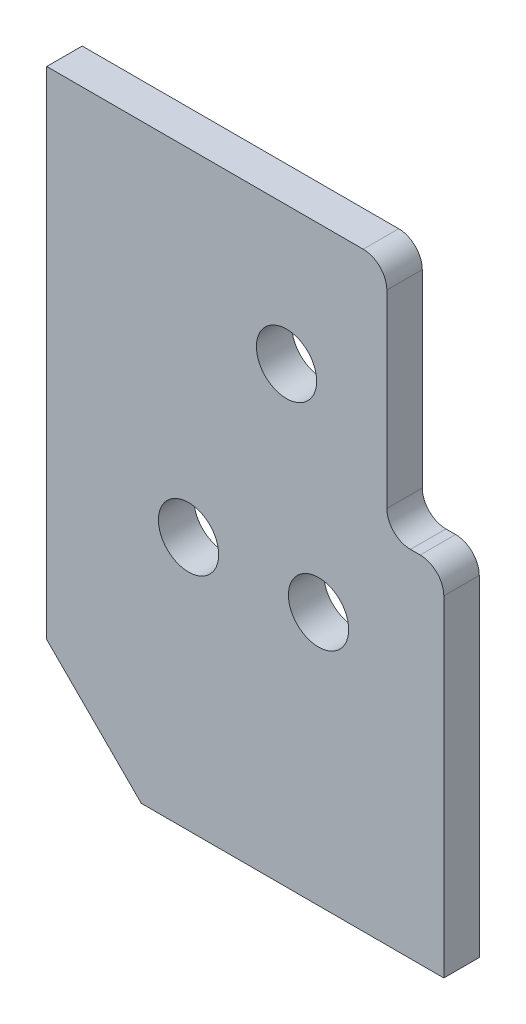
ISO-10303-21;
HEADER;
FILE_DESCRIPTION(('STEP AP214'),'2;1');
FILE_NAME('part.step','',(''),(''),'','','');
FILE_SCHEMA(('AUTOMOTIVE_DESIGN { 1 0 10303 214 1 1 1 1 }'));
ENDSEC;
DATA;
#1=APPLICATION_CONTEXT('core data for automotive mechanical design processes');
#2=APPLICATION_PROTOCOL_DEFINITION('international standard','automotive_design',2000,#1);
#3=PRODUCT_CONTEXT('',#1,'mechanical');
#4=PRODUCT('Part','Part','',(#3));
#5=PRODUCT_RELATED_PRODUCT_CATEGORY('part','',(#4));
#6=PRODUCT_DEFINITION_FORMATION('','',#4);
#7=PRODUCT_DEFINITION_CONTEXT('part definition',#1,'design');
#8=PRODUCT_DEFINITION('design','',#6,#7);
#9=PRODUCT_DEFINITION_SHAPE('','',#8);
#10=(LENGTH_UNIT() NAMED_UNIT(*) SI_UNIT(.MILLI.,.METRE.));
#11=(NAMED_UNIT(*) PLANE_ANGLE_UNIT() SI_UNIT($,.RADIAN.));
#12=(NAMED_UNIT(*) SI_UNIT($,.STERADIAN.) SOLID_ANGLE_UNIT());
#13=UNCERTAINTY_MEASURE_WITH_UNIT(LENGTH_MEASURE(1.E-05),#10,'distance_accuracy_value','');
#14=(GEOMETRIC_REPRESENTATION_CONTEXT(3) GLOBAL_UNCERTAINTY_ASSIGNED_CONTEXT((#13)) GLOBAL_UNIT_ASSIGNED_CONTEXT((#10,
#11,#12)) REPRESENTATION_CONTEXT('',''));
#15=CARTESIAN_POINT('',(0.,0.,0.));
#16=DIRECTION('',(0.,0.,1.));
#17=DIRECTION('',(1.,0.,0.));
#18=AXIS2_PLACEMENT_3D('',#15,#16,#17);
#19=CARTESIAN_POINT('',(1430.87577896359,-834.879746467993,3.));
#20=DIRECTION('',(0.,0.,1.));
#21=DIRECTION('',(1.,0.,0.));
#22=AXIS2_PLACEMENT_3D('',#19,#20,#21);
#23=PLANE('',#22);
#24=CARTESIAN_POINT('',(1416.09647773245,-861.379746467872,3.));
#25=DIRECTION('',(0.,0.,1.));
#26=DIRECTION('',(1.,0.,0.));
#27=AXIS2_PLACEMENT_3D('',#24,#25,#26);
#28=CIRCLE('',#27,2.55000000000004);
#29=CARTESIAN_POINT('',(1418.64647773245,-861.379746467872,3.));
#30=VERTEX_POINT('',#29);
#31=EDGE_CURVE('E211',#30,#30,#28,.T.);
#32=ORIENTED_EDGE('',*,*,#31,.F.);
#33=EDGE_LOOP('',(#32));
#34=FACE_BOUND('',#33,.T.);
#35=CARTESIAN_POINT('',(1430.87577896359,-834.879746467993,3.));
#36=DIRECTION('',(0.,0.,1.));
#37=DIRECTION('',(1.,0.,0.));
#38=AXIS2_PLACEMENT_3D('',#35,#36,#37);
#39=CIRCLE('',#38,2.);
#40=CARTESIAN_POINT('',(1432.87577896359,-834.879746467993,3.));
#41=VERTEX_POINT('',#40);
#42=CARTESIAN_POINT('',(1430.87577896359,-832.879746467993,3.));
#43=VERTEX_POINT('',#42);
#44=EDGE_CURVE('E160',#41,#43,#39,.T.);
#45=ORIENTED_EDGE('',*,*,#44,.T.);
#46=DIRECTION('',(-1.,0.,0.));
#47=VECTOR('',#46,1.);
#48=CARTESIAN_POINT('',(1430.87577896359,-832.879746467993,3.));
#49=LINE('',#48,#47);
#50=CARTESIAN_POINT('',(1404.09647773244,-832.879746467993,3.));
#51=VERTEX_POINT('',#50);
#52=EDGE_CURVE('E98',#43,#51,#49,.T.);
#53=ORIENTED_EDGE('',*,*,#52,.T.);
#54=DIRECTION('',(0.,-1.,0.));
#55=VECTOR('',#54,1.);
#56=CARTESIAN_POINT('',(1404.09647773244,-832.879746467993,3.));
#57=LINE('',#56,#55);
#58=CARTESIAN_POINT('',(1404.09647773244,-874.879746467994,3.));
#59=VERTEX_POINT('',#58);
#60=EDGE_CURVE('E181',#51,#59,#57,.T.);
#61=ORIENTED_EDGE('',*,*,#60,.T.);
#62=DIRECTION('',(0.707106781186547,-0.707106781186547,0.));
#63=VECTOR('',#62,1.);
#64=CARTESIAN_POINT('',(1404.09647773244,-874.879746467994,3.));
#65=LINE('',#64,#63);
#66=CARTESIAN_POINT('',(1412.09647773244,-882.879746467994,3.));
#67=VERTEX_POINT('',#66);
#68=EDGE_CURVE('E200',#59,#67,#65,.T.);
#69=ORIENTED_EDGE('',*,*,#68,.T.);
#70=DIRECTION('',(1.,0.,0.));
#71=VECTOR('',#70,1.);
#72=CARTESIAN_POINT('',(1412.09647773244,-882.879746467994,3.));
#73=LINE('',#72,#71);
#74=CARTESIAN_POINT('',(1437.69647773233,-882.879746467993,3.));
#75=VERTEX_POINT('',#74);
#76=EDGE_CURVE('E197',#67,#75,#73,.T.);
#77=ORIENTED_EDGE('',*,*,#76,.T.);
#78=DIRECTION('',(0.,1.,0.));
#79=VECTOR('',#78,1.);
#80=CARTESIAN_POINT('',(1437.69647773233,-882.879746467993,3.));
#81=LINE('',#80,#79);
#82=CARTESIAN_POINT('',(1437.69647773233,-854.879746467993,3.));
#83=VERTEX_POINT('',#82);
#84=EDGE_CURVE('E199',#75,#83,#81,.T.);
#85=ORIENTED_EDGE('',*,*,#84,.T.);
#86=CARTESIAN_POINT('',(1435.69647773233,-854.879746467993,3.));
#87=DIRECTION('',(0.,0.,1.));
#88=DIRECTION('',(1.,0.,0.));
#89=AXIS2_PLACEMENT_3D('',#86,#87,#88);
#90=CIRCLE('',#89,2.);
#91=CARTESIAN_POINT('',(1435.69647773233,-852.879746467993,3.));
#92=VERTEX_POINT('',#91);
#93=EDGE_CURVE('E123',#83,#92,#90,.T.);
#94=ORIENTED_EDGE('',*,*,#93,.T.);
#95=DIRECTION('',(-1.,-1.35277773881484E-13,0.));
#96=VECTOR('',#95,1.);
#97=CARTESIAN_POINT('',(1435.69647773233,-852.879746467993,3.));
#98=LINE('',#97,#96);
#99=CARTESIAN_POINT('',(1434.87577896359,-852.879746467994,3.));
#100=VERTEX_POINT('',#99);
#101=EDGE_CURVE('E117',#92,#100,#98,.T.);
#102=ORIENTED_EDGE('',*,*,#101,.T.);
#103=CARTESIAN_POINT('',(1434.87577896359,-850.879746467993,3.));
#104=DIRECTION('',(0.,0.,-1.));
#105=DIRECTION('',(-1.,0.,0.));
#106=AXIS2_PLACEMENT_3D('',#103,#104,#105);
#107=CIRCLE('',#106,2.);
#108=CARTESIAN_POINT('',(1432.87577896359,-850.879746467993,3.));
#109=VERTEX_POINT('',#108);
#110=EDGE_CURVE('E121',#100,#109,#107,.T.);
#111=ORIENTED_EDGE('',*,*,#110,.T.);
#112=DIRECTION('',(0.,1.,0.));
#113=VECTOR('',#112,1.);
#114=CARTESIAN_POINT('',(1432.87577896359,-850.879746467993,3.));
#115=LINE('',#114,#113);
#116=EDGE_CURVE('E49',#109,#41,#115,.T.);
#117=ORIENTED_EDGE('',*,*,#116,.T.);
#118=EDGE_LOOP('',(#45,#53,#61,#69,#77,#85,#94,#102,#111,#117));
#119=FACE_BOUND('',#118,.T.);
#120=CARTESIAN_POINT('',(1427.09647773244,-861.379746467872,3.));
#121=DIRECTION('',(0.,0.,1.));
#122=DIRECTION('',(1.,0.,0.));
#123=AXIS2_PLACEMENT_3D('',#120,#121,#122);
#124=CIRCLE('',#123,2.55000000000007);
#125=CARTESIAN_POINT('',(1429.64647773244,-861.379746467872,3.));
#126=VERTEX_POINT('',#125);
#127=EDGE_CURVE('E145',#126,#126,#124,.T.);
#128=ORIENTED_EDGE('',*,*,#127,.F.);
#129=EDGE_LOOP('',(#128));
#130=FACE_BOUND('',#129,.T.);
#131=CARTESIAN_POINT('',(1424.38601137906,-844.526955434372,3.));
#132=DIRECTION('',(0.,0.,1.));
#133=DIRECTION('',(1.,0.,0.));
#134=AXIS2_PLACEMENT_3D('',#131,#132,#133);
#135=CIRCLE('',#134,2.55000000000004);
#136=CARTESIAN_POINT('',(1426.93601137906,-844.526955434372,3.));
#137=VERTEX_POINT('',#136);
#138=EDGE_CURVE('E217',#137,#137,#135,.T.);
#139=ORIENTED_EDGE('',*,*,#138,.F.);
#140=EDGE_LOOP('',(#139));
#141=FACE_BOUND('',#140,.T.);
#142=ADVANCED_FACE('F32',(#34,#119,#130,#141),#23,.T.);
#143=CARTESIAN_POINT('',(1430.87577896359,-834.879746467993,0.));
#144=DIRECTION('',(0.,0.,1.));
#145=DIRECTION('',(1.,0.,0.));
#146=AXIS2_PLACEMENT_3D('',#143,#144,#145);
#147=PLANE('',#146);
#148=CARTESIAN_POINT('',(1430.87577896359,-834.879746467993,0.));
#149=DIRECTION('',(0.,0.,1.));
#150=DIRECTION('',(1.,0.,0.));
#151=AXIS2_PLACEMENT_3D('',#148,#149,#150);
#152=CIRCLE('',#151,2.);
#153=CARTESIAN_POINT('',(1432.87577896359,-834.879746467993,0.));
#154=VERTEX_POINT('',#153);
#155=CARTESIAN_POINT('',(1430.87577896359,-832.879746467993,0.));
#156=VERTEX_POINT('',#155);
#157=EDGE_CURVE('E141',#154,#156,#152,.T.);
#158=ORIENTED_EDGE('',*,*,#157,.F.);
#159=DIRECTION('',(0.,1.,0.));
#160=VECTOR('',#159,1.);
#161=CARTESIAN_POINT('',(1432.87577896359,-850.879746467993,0.));
#162=LINE('',#161,#160);
#163=CARTESIAN_POINT('',(1432.87577896359,-850.879746467993,0.));
#164=VERTEX_POINT('',#163);
#165=EDGE_CURVE('E90',#164,#154,#162,.T.);
#166=ORIENTED_EDGE('',*,*,#165,.F.);
#167=CARTESIAN_POINT('',(1434.87577896359,-850.879746467993,0.));
#168=DIRECTION('',(0.,0.,-1.));
#169=DIRECTION('',(-1.,0.,0.));
#170=AXIS2_PLACEMENT_3D('',#167,#168,#169);
#171=CIRCLE('',#170,2.);
#172=CARTESIAN_POINT('',(1434.87577896359,-852.879746467994,0.));
#173=VERTEX_POINT('',#172);
#174=EDGE_CURVE('E84',#173,#164,#171,.T.);
#175=ORIENTED_EDGE('',*,*,#174,.F.);
#176=DIRECTION('',(-1.,-1.35277773881484E-13,0.));
#177=VECTOR('',#176,1.);
#178=CARTESIAN_POINT('',(1435.69647773233,-852.879746467993,0.));
#179=LINE('',#178,#177);
#180=CARTESIAN_POINT('',(1435.69647773233,-852.879746467993,0.));
#181=VERTEX_POINT('',#180);
#182=EDGE_CURVE('E131',#181,#173,#179,.T.);
#183=ORIENTED_EDGE('',*,*,#182,.F.);
#184=CARTESIAN_POINT('',(1435.69647773233,-854.879746467993,0.));
#185=DIRECTION('',(0.,0.,1.));
#186=DIRECTION('',(1.,0.,0.));
#187=AXIS2_PLACEMENT_3D('',#184,#185,#186);
#188=CIRCLE('',#187,2.);
#189=CARTESIAN_POINT('',(1437.69647773233,-854.879746467993,0.));
#190=VERTEX_POINT('',#189);
#191=EDGE_CURVE('E155',#190,#181,#188,.T.);
#192=ORIENTED_EDGE('',*,*,#191,.F.);
#193=DIRECTION('',(0.,1.,0.));
#194=VECTOR('',#193,1.);
#195=CARTESIAN_POINT('',(1437.69647773233,-882.879746467993,0.));
#196=LINE('',#195,#194);
#197=CARTESIAN_POINT('',(1437.69647773233,-882.879746467993,0.));
#198=VERTEX_POINT('',#197);
#199=EDGE_CURVE('E153',#198,#190,#196,.T.);
#200=ORIENTED_EDGE('',*,*,#199,.F.);
#201=DIRECTION('',(1.,0.,0.));
#202=VECTOR('',#201,1.);
#203=CARTESIAN_POINT('',(1412.09647773244,-882.879746467994,0.));
#204=LINE('',#203,#202);
#205=CARTESIAN_POINT('',(1412.09647773244,-882.879746467994,0.));
#206=VERTEX_POINT('',#205);
#207=EDGE_CURVE('E151',#206,#198,#204,.T.);
#208=ORIENTED_EDGE('',*,*,#207,.F.);
#209=DIRECTION('',(0.707106781186547,-0.707106781186547,0.));
#210=VECTOR('',#209,1.);
#211=CARTESIAN_POINT('',(1404.09647773244,-874.879746467994,0.));
#212=LINE('',#211,#210);
#213=CARTESIAN_POINT('',(1404.09647773244,-874.879746467994,0.));
#214=VERTEX_POINT('',#213);
#215=EDGE_CURVE('E149',#214,#206,#212,.T.);
#216=ORIENTED_EDGE('',*,*,#215,.F.);
#217=DIRECTION('',(0.,-1.,0.));
#218=VECTOR('',#217,1.);
#219=CARTESIAN_POINT('',(1404.09647773244,-832.879746467993,0.));
#220=LINE('',#219,#218);
#221=CARTESIAN_POINT('',(1404.09647773244,-832.879746467993,0.));
#222=VERTEX_POINT('',#221);
#223=EDGE_CURVE('E147',#222,#214,#220,.T.);
#224=ORIENTED_EDGE('',*,*,#223,.F.);
#225=DIRECTION('',(-1.,0.,0.));
#226=VECTOR('',#225,1.);
#227=CARTESIAN_POINT('',(1430.87577896359,-832.879746467993,0.));
#228=LINE('',#227,#226);
#229=EDGE_CURVE('E144',#156,#222,#228,.T.);
#230=ORIENTED_EDGE('',*,*,#229,.F.);
#231=EDGE_LOOP('',(#158,#166,#175,#183,#192,#200,#208,#216,#224,#230));
#232=FACE_BOUND('',#231,.T.);
#233=CARTESIAN_POINT('',(1427.09647773244,-861.379746467872,0.));
#234=DIRECTION('',(0.,0.,1.));
#235=DIRECTION('',(1.,0.,0.));
#236=AXIS2_PLACEMENT_3D('',#233,#234,#235);
#237=CIRCLE('',#236,2.55000000000007);
#238=CARTESIAN_POINT('',(1429.64647773244,-861.379746467872,0.));
#239=VERTEX_POINT('',#238);
#240=EDGE_CURVE('E208',#239,#239,#237,.T.);
#241=ORIENTED_EDGE('',*,*,#240,.T.);
#242=EDGE_LOOP('',(#241));
#243=FACE_BOUND('',#242,.T.);
#244=CARTESIAN_POINT('',(1416.09647773245,-861.379746467872,0.));
#245=DIRECTION('',(0.,0.,1.));
#246=DIRECTION('',(1.,0.,0.));
#247=AXIS2_PLACEMENT_3D('',#244,#245,#246);
#248=CIRCLE('',#247,2.55000000000004);
#249=CARTESIAN_POINT('',(1418.64647773245,-861.379746467872,0.));
#250=VERTEX_POINT('',#249);
#251=EDGE_CURVE('E214',#250,#250,#248,.T.);
#252=ORIENTED_EDGE('',*,*,#251,.T.);
#253=EDGE_LOOP('',(#252));
#254=FACE_BOUND('',#253,.T.);
#255=CARTESIAN_POINT('',(1424.38601137906,-844.526955434372,0.));
#256=DIRECTION('',(0.,0.,1.));
#257=DIRECTION('',(1.,0.,0.));
#258=AXIS2_PLACEMENT_3D('',#255,#256,#257);
#259=CIRCLE('',#258,2.55000000000004);
#260=CARTESIAN_POINT('',(1426.93601137906,-844.526955434372,0.));
#261=VERTEX_POINT('',#260);
#262=EDGE_CURVE('E220',#261,#261,#259,.T.);
#263=ORIENTED_EDGE('',*,*,#262,.T.);
#264=EDGE_LOOP('',(#263));
#265=FACE_BOUND('',#264,.T.);
#266=ADVANCED_FACE('F185',(#232,#243,#254,#265),#147,.F.);
#267=CARTESIAN_POINT('',(1430.87577896359,-834.879746467993,3.));
#268=DIRECTION('',(0.,0.,-1.));
#269=DIRECTION('',(-1.,0.,0.));
#270=AXIS2_PLACEMENT_3D('',#267,#268,#269);
#271=CYLINDRICAL_SURFACE('',#270,2.);
#272=ORIENTED_EDGE('',*,*,#157,.T.);
#273=DIRECTION('',(0.,0.,-1.));
#274=VECTOR('',#273,1.);
#275=CARTESIAN_POINT('',(1430.87577896359,-832.879746467993,3.));
#276=LINE('',#275,#274);
#277=EDGE_CURVE('E11',#43,#156,#276,.T.);
#278=ORIENTED_EDGE('',*,*,#277,.F.);
#279=ORIENTED_EDGE('',*,*,#44,.F.);
#280=DIRECTION('',(0.,0.,-1.));
#281=VECTOR('',#280,1.);
#282=CARTESIAN_POINT('',(1432.87577896359,-834.879746467993,3.));
#283=LINE('',#282,#281);
#284=EDGE_CURVE('E137',#41,#154,#283,.T.);
#285=ORIENTED_EDGE('',*,*,#284,.T.);
#286=EDGE_LOOP('',(#272,#278,#279,#285));
#287=FACE_BOUND('',#286,.T.);
#288=ADVANCED_FACE('F34',(#287),#271,.T.);
#289=CARTESIAN_POINT('',(1430.87577896359,-832.879746467993,3.));
#290=DIRECTION('',(0.,-1.,0.));
#291=DIRECTION('',(1.,0.,0.));
#292=AXIS2_PLACEMENT_3D('',#289,#290,#291);
#293=PLANE('',#292);
#294=ORIENTED_EDGE('',*,*,#229,.T.);
#295=DIRECTION('',(0.,0.,-1.));
#296=VECTOR('',#295,1.);
#297=CARTESIAN_POINT('',(1404.09647773244,-832.879746467993,3.));
#298=LINE('',#297,#296);
#299=EDGE_CURVE('E41',#51,#222,#298,.T.);
#300=ORIENTED_EDGE('',*,*,#299,.F.);
#301=ORIENTED_EDGE('',*,*,#52,.F.);
#302=ORIENTED_EDGE('',*,*,#277,.T.);
#303=EDGE_LOOP('',(#294,#300,#301,#302));
#304=FACE_BOUND('',#303,.T.);
#305=ADVANCED_FACE('F261',(#304),#293,.F.);
#306=CARTESIAN_POINT('',(1404.09647773244,-832.879746467993,3.));
#307=DIRECTION('',(1.,0.,0.));
#308=DIRECTION('',(0.,1.,0.));
#309=AXIS2_PLACEMENT_3D('',#306,#307,#308);
#310=PLANE('',#309);
#311=ORIENTED_EDGE('',*,*,#223,.T.);
#312=DIRECTION('',(0.,0.,-1.));
#313=VECTOR('',#312,1.);
#314=CARTESIAN_POINT('',(1404.09647773244,-874.879746467994,3.));
#315=LINE('',#314,#313);
#316=EDGE_CURVE('E173',#59,#214,#315,.T.);
#317=ORIENTED_EDGE('',*,*,#316,.F.);
#318=ORIENTED_EDGE('',*,*,#60,.F.);
#319=ORIENTED_EDGE('',*,*,#299,.T.);
#320=EDGE_LOOP('',(#311,#317,#318,#319));
#321=FACE_BOUND('',#320,.T.);
#322=ADVANCED_FACE('F179',(#321),#310,.F.);
#323=CARTESIAN_POINT('',(1404.09647773244,-874.879746467994,3.));
#324=DIRECTION('',(0.707106781186548,0.707106781186548,0.));
#325=DIRECTION('',(-0.707106781186548,0.707106781186548,0.));
#326=AXIS2_PLACEMENT_3D('',#323,#324,#325);
#327=PLANE('',#326);
#328=ORIENTED_EDGE('',*,*,#215,.T.);
#329=DIRECTION('',(0.,0.,-1.));
#330=VECTOR('',#329,1.);
#331=CARTESIAN_POINT('',(1412.09647773244,-882.879746467994,3.));
#332=LINE('',#331,#330);
#333=EDGE_CURVE('E170',#67,#206,#332,.T.);
#334=ORIENTED_EDGE('',*,*,#333,.F.);
#335=ORIENTED_EDGE('',*,*,#68,.F.);
#336=ORIENTED_EDGE('',*,*,#316,.T.);
#337=EDGE_LOOP('',(#328,#334,#335,#336));
#338=FACE_BOUND('',#337,.T.);
#339=ADVANCED_FACE('F191',(#338),#327,.F.);
#340=CARTESIAN_POINT('',(1412.09647773244,-882.879746467994,3.));
#341=DIRECTION('',(0.,1.,0.));
#342=DIRECTION('',(-1.,0.,0.));
#343=AXIS2_PLACEMENT_3D('',#340,#341,#342);
#344=PLANE('',#343);
#345=ORIENTED_EDGE('',*,*,#207,.T.);
#346=DIRECTION('',(0.,0.,-1.));
#347=VECTOR('',#346,1.);
#348=CARTESIAN_POINT('',(1437.69647773233,-882.879746467993,3.));
#349=LINE('',#348,#347);
#350=EDGE_CURVE('E167',#75,#198,#349,.T.);
#351=ORIENTED_EDGE('',*,*,#350,.F.);
#352=ORIENTED_EDGE('',*,*,#76,.F.);
#353=ORIENTED_EDGE('',*,*,#333,.T.);
#354=EDGE_LOOP('',(#345,#351,#352,#353));
#355=FACE_BOUND('',#354,.T.);
#356=ADVANCED_FACE('F195',(#355),#344,.F.);
#357=CARTESIAN_POINT('',(1437.69647773233,-882.879746467993,3.));
#358=DIRECTION('',(-1.,0.,0.));
#359=DIRECTION('',(0.,-1.,0.));
#360=AXIS2_PLACEMENT_3D('',#357,#358,#359);
#361=PLANE('',#360);
#362=ORIENTED_EDGE('',*,*,#199,.T.);
#363=DIRECTION('',(0.,0.,-1.));
#364=VECTOR('',#363,1.);
#365=CARTESIAN_POINT('',(1437.69647773233,-854.879746467993,3.));
#366=LINE('',#365,#364);
#367=EDGE_CURVE('E164',#83,#190,#366,.T.);
#368=ORIENTED_EDGE('',*,*,#367,.F.);
#369=ORIENTED_EDGE('',*,*,#84,.F.);
#370=ORIENTED_EDGE('',*,*,#350,.T.);
#371=EDGE_LOOP('',(#362,#368,#369,#370));
#372=FACE_BOUND('',#371,.T.);
#373=ADVANCED_FACE('F251',(#372),#361,.F.);
#374=CARTESIAN_POINT('',(1435.69647773233,-854.879746467993,3.));
#375=DIRECTION('',(0.,0.,-1.));
#376=DIRECTION('',(-1.,0.,0.));
#377=AXIS2_PLACEMENT_3D('',#374,#375,#376);
#378=CYLINDRICAL_SURFACE('',#377,2.);
#379=ORIENTED_EDGE('',*,*,#191,.T.);
#380=DIRECTION('',(0.,0.,-1.));
#381=VECTOR('',#380,1.);
#382=CARTESIAN_POINT('',(1435.69647773233,-852.879746467993,3.));
#383=LINE('',#382,#381);
#384=EDGE_CURVE('E132',#92,#181,#383,.T.);
#385=ORIENTED_EDGE('',*,*,#384,.F.);
#386=ORIENTED_EDGE('',*,*,#93,.F.);
#387=ORIENTED_EDGE('',*,*,#367,.T.);
#388=EDGE_LOOP('',(#379,#385,#386,#387));
#389=FACE_BOUND('',#388,.T.);
#390=ADVANCED_FACE('F248',(#389),#378,.T.);
#391=CARTESIAN_POINT('',(1435.69647773233,-852.879746467993,3.));
#392=DIRECTION('',(1.35277773881484E-13,-1.,0.));
#393=DIRECTION('',(1.,1.35277773881484E-13,0.));
#394=AXIS2_PLACEMENT_3D('',#391,#392,#393);
#395=PLANE('',#394);
#396=ORIENTED_EDGE('',*,*,#182,.T.);
#397=DIRECTION('',(0.,0.,-1.));
#398=VECTOR('',#397,1.);
#399=CARTESIAN_POINT('',(1434.87577896359,-852.879746467994,3.));
#400=LINE('',#399,#398);
#401=EDGE_CURVE('E128',#100,#173,#400,.T.);
#402=ORIENTED_EDGE('',*,*,#401,.F.);
#403=ORIENTED_EDGE('',*,*,#101,.F.);
#404=ORIENTED_EDGE('',*,*,#384,.T.);
#405=EDGE_LOOP('',(#396,#402,#403,#404));
#406=FACE_BOUND('',#405,.T.);
#407=ADVANCED_FACE('F129',(#406),#395,.F.);
#408=CARTESIAN_POINT('',(1434.87577896359,-850.879746467993,3.));
#409=DIRECTION('',(0.,0.,-1.));
#410=DIRECTION('',(-1.,0.,0.));
#411=AXIS2_PLACEMENT_3D('',#408,#409,#410);
#412=CYLINDRICAL_SURFACE('',#411,2.);
#413=ORIENTED_EDGE('',*,*,#174,.T.);
#414=DIRECTION('',(0.,0.,-1.));
#415=VECTOR('',#414,1.);
#416=CARTESIAN_POINT('',(1432.87577896359,-850.879746467993,3.));
#417=LINE('',#416,#415);
#418=EDGE_CURVE('E133',#109,#164,#417,.T.);
#419=ORIENTED_EDGE('',*,*,#418,.F.);
#420=ORIENTED_EDGE('',*,*,#110,.F.);
#421=ORIENTED_EDGE('',*,*,#401,.T.);
#422=EDGE_LOOP('',(#413,#419,#420,#421));
#423=FACE_BOUND('',#422,.T.);
#424=ADVANCED_FACE('F135',(#423),#412,.F.);
#425=CARTESIAN_POINT('',(1432.87577896359,-850.879746467993,3.));
#426=DIRECTION('',(-1.,0.,0.));
#427=DIRECTION('',(0.,-1.,0.));
#428=AXIS2_PLACEMENT_3D('',#425,#426,#427);
#429=PLANE('',#428);
#430=ORIENTED_EDGE('',*,*,#165,.T.);
#431=ORIENTED_EDGE('',*,*,#284,.F.);
#432=ORIENTED_EDGE('',*,*,#116,.F.);
#433=ORIENTED_EDGE('',*,*,#418,.T.);
#434=EDGE_LOOP('',(#430,#431,#432,#433));
#435=FACE_BOUND('',#434,.T.);
#436=ADVANCED_FACE('F241',(#435),#429,.F.);
#437=CARTESIAN_POINT('',(1427.09647773244,-861.379746467872,3.));
#438=DIRECTION('',(0.,0.,-1.));
#439=DIRECTION('',(-1.,0.,0.));
#440=AXIS2_PLACEMENT_3D('',#437,#438,#439);
#441=CYLINDRICAL_SURFACE('',#440,2.55000000000007);
#442=ORIENTED_EDGE('',*,*,#127,.T.);
#443=EDGE_LOOP('',(#442));
#444=FACE_BOUND('',#443,.T.);
#445=ORIENTED_EDGE('',*,*,#240,.F.);
#446=EDGE_LOOP('',(#445));
#447=FACE_BOUND('',#446,.T.);
#448=ADVANCED_FACE('F238',(#444,#447),#441,.F.);
#449=CARTESIAN_POINT('',(1416.09647773245,-861.379746467872,3.));
#450=DIRECTION('',(0.,0.,-1.));
#451=DIRECTION('',(-1.,0.,0.));
#452=AXIS2_PLACEMENT_3D('',#449,#450,#451);
#453=CYLINDRICAL_SURFACE('',#452,2.55000000000004);
#454=ORIENTED_EDGE('',*,*,#31,.T.);
#455=EDGE_LOOP('',(#454));
#456=FACE_BOUND('',#455,.T.);
#457=ORIENTED_EDGE('',*,*,#251,.F.);
#458=EDGE_LOOP('',(#457));
#459=FACE_BOUND('',#458,.T.);
#460=ADVANCED_FACE('F336',(#456,#459),#453,.F.);
#461=CARTESIAN_POINT('',(1424.38601137906,-844.526955434372,3.));
#462=DIRECTION('',(0.,0.,-1.));
#463=DIRECTION('',(-1.,0.,0.));
#464=AXIS2_PLACEMENT_3D('',#461,#462,#463);
#465=CYLINDRICAL_SURFACE('',#464,2.55000000000004);
#466=ORIENTED_EDGE('',*,*,#138,.T.);
#467=EDGE_LOOP('',(#466));
#468=FACE_BOUND('',#467,.T.);
#469=ORIENTED_EDGE('',*,*,#262,.F.);
#470=EDGE_LOOP('',(#469));
#471=FACE_BOUND('',#470,.T.);
#472=ADVANCED_FACE('F226',(#468,#471),#465,.F.);
#473=CLOSED_SHELL('',(#142,#266,#288,#305,#322,#339,#356,#373,#390,#407,#424,#436,#448,#460,#472));
#474=MANIFOLD_SOLID_BREP('B2',#473);
#475=ADVANCED_BREP_SHAPE_REPRESENTATION('',(#18,#474),#14);
#476=SHAPE_DEFINITION_REPRESENTATION(#9,#475);
ENDSEC;
END-ISO-10303-21;
